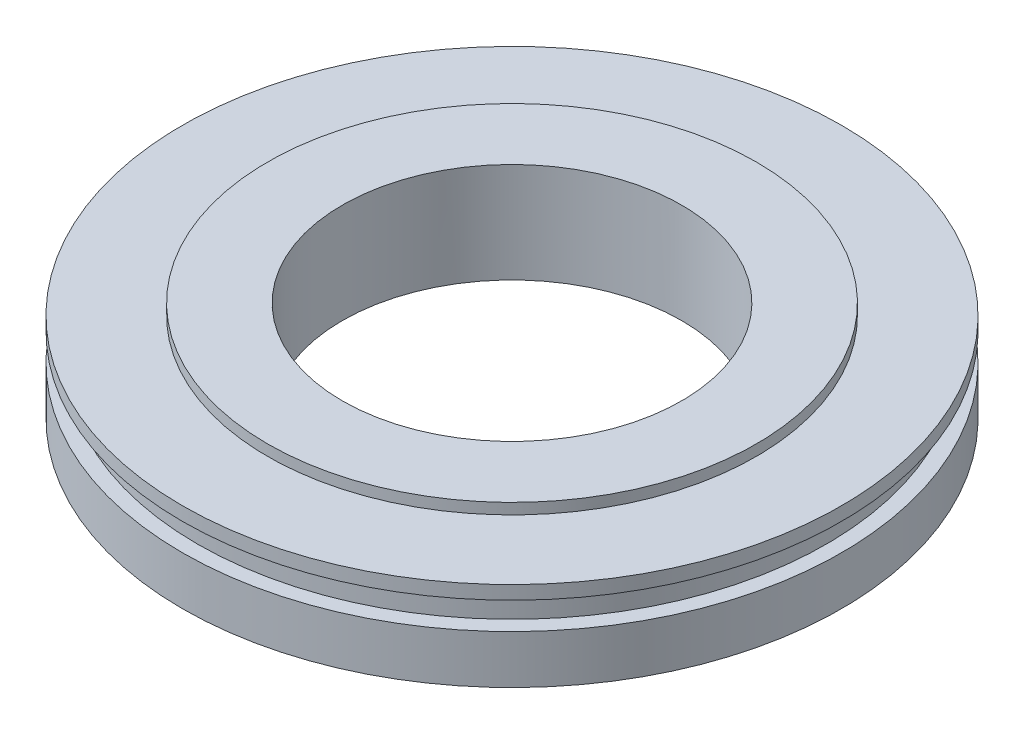
ISO-10303-21;
HEADER;
FILE_DESCRIPTION(('STEP AP214'),'2;1');
FILE_NAME('part.step','',(''),(''),'','','');
FILE_SCHEMA(('AUTOMOTIVE_DESIGN { 1 0 10303 214 1 1 1 1 }'));
ENDSEC;
DATA;
#1=APPLICATION_CONTEXT('core data for automotive mechanical design processes');
#2=APPLICATION_PROTOCOL_DEFINITION('international standard','automotive_design',2000,#1);
#3=PRODUCT_CONTEXT('',#1,'mechanical');
#4=PRODUCT('Part','Part','',(#3));
#5=PRODUCT_RELATED_PRODUCT_CATEGORY('part','',(#4));
#6=PRODUCT_DEFINITION_FORMATION('','',#4);
#7=PRODUCT_DEFINITION_CONTEXT('part definition',#1,'design');
#8=PRODUCT_DEFINITION('design','',#6,#7);
#9=PRODUCT_DEFINITION_SHAPE('','',#8);
#10=(LENGTH_UNIT() NAMED_UNIT(*) SI_UNIT(.MILLI.,.METRE.));
#11=(NAMED_UNIT(*) PLANE_ANGLE_UNIT() SI_UNIT($,.RADIAN.));
#12=(NAMED_UNIT(*) SI_UNIT($,.STERADIAN.) SOLID_ANGLE_UNIT());
#13=UNCERTAINTY_MEASURE_WITH_UNIT(LENGTH_MEASURE(1.E-05),#10,'distance_accuracy_value','');
#14=(GEOMETRIC_REPRESENTATION_CONTEXT(3) GLOBAL_UNCERTAINTY_ASSIGNED_CONTEXT((#13)) GLOBAL_UNIT_ASSIGNED_CONTEXT((#10,
#11,#12)) REPRESENTATION_CONTEXT('',''));
#15=CARTESIAN_POINT('',(0.,0.,0.));
#16=DIRECTION('',(0.,0.,1.));
#17=DIRECTION('',(1.,0.,0.));
#18=AXIS2_PLACEMENT_3D('',#15,#16,#17);
#19=CARTESIAN_POINT('',(0.,2.74793199999976,0.));
#20=DIRECTION('',(0.,-1.,0.));
#21=DIRECTION('',(0.,0.,-1.));
#22=AXIS2_PLACEMENT_3D('',#19,#20,#21);
#23=PLANE('',#22);
#24=CARTESIAN_POINT('',(0.,2.74793199999976,0.));
#25=DIRECTION('',(0.,-1.,0.));
#26=DIRECTION('',(0.,0.,-1.));
#27=AXIS2_PLACEMENT_3D('',#24,#25,#26);
#28=CIRCLE('',#27,30.84068);
#29=CARTESIAN_POINT('',(0.,2.74793199999976,-30.84068));
#30=VERTEX_POINT('',#29);
#31=EDGE_CURVE('E71',#30,#30,#28,.T.);
#32=ORIENTED_EDGE('',*,*,#31,.F.);
#33=EDGE_LOOP('',(#32));
#34=FACE_BOUND('',#33,.T.);
#35=CARTESIAN_POINT('',(0.,2.74793199999976,0.));
#36=DIRECTION('',(0.,-1.,0.));
#37=DIRECTION('',(0.,0.,-1.));
#38=AXIS2_PLACEMENT_3D('',#35,#36,#37);
#39=CIRCLE('',#38,22.86);
#40=CARTESIAN_POINT('',(0.,2.74793199999976,-22.86));
#41=VERTEX_POINT('',#40);
#42=EDGE_CURVE('E10',#41,#41,#39,.F.);
#43=ORIENTED_EDGE('',*,*,#42,.F.);
#44=EDGE_LOOP('',(#43));
#45=FACE_BOUND('',#44,.T.);
#46=ADVANCED_FACE('F43',(#34,#45),#23,.F.);
#47=CARTESIAN_POINT('',(0.,0.,0.));
#48=DIRECTION('',(0.,1.,0.));
#49=DIRECTION('',(0.,0.,1.));
#50=AXIS2_PLACEMENT_3D('',#47,#48,#49);
#51=CYLINDRICAL_SURFACE('',#50,15.875);
#52=CARTESIAN_POINT('',(0.,3.76393199999976,0.));
#53=DIRECTION('',(0.,1.,0.));
#54=DIRECTION('',(0.,0.,1.));
#55=AXIS2_PLACEMENT_3D('',#52,#53,#54);
#56=CIRCLE('',#55,15.875);
#57=CARTESIAN_POINT('',(0.,3.76393199999976,15.875));
#58=VERTEX_POINT('',#57);
#59=EDGE_CURVE('E79',#58,#58,#56,.T.);
#60=ORIENTED_EDGE('',*,*,#59,.T.);
#61=EDGE_LOOP('',(#60));
#62=FACE_BOUND('',#61,.T.);
#63=CARTESIAN_POINT('',(0.,-5.59993800000007,0.));
#64=DIRECTION('',(0.,-1.,0.));
#65=DIRECTION('',(0.,0.,-1.));
#66=AXIS2_PLACEMENT_3D('',#63,#64,#65);
#67=CIRCLE('',#66,15.875);
#68=CARTESIAN_POINT('',(0.,-5.59993800000007,-15.875));
#69=VERTEX_POINT('',#68);
#70=EDGE_CURVE('E87',#69,#69,#67,.T.);
#71=ORIENTED_EDGE('',*,*,#70,.T.);
#72=EDGE_LOOP('',(#71));
#73=FACE_BOUND('',#72,.T.);
#74=ADVANCED_FACE('F45',(#62,#73),#51,.F.);
#75=CARTESIAN_POINT('',(0.,0.,0.));
#76=DIRECTION('',(0.,1.,0.));
#77=DIRECTION('',(0.,0.,1.));
#78=AXIS2_PLACEMENT_3D('',#75,#76,#77);
#79=CYLINDRICAL_SURFACE('',#78,30.84068);
#80=CARTESIAN_POINT('',(0.,-1.06206800000024,0.));
#81=DIRECTION('',(0.,1.,0.));
#82=DIRECTION('',(0.,0.,1.));
#83=AXIS2_PLACEMENT_3D('',#80,#81,#82);
#84=CIRCLE('',#83,30.84068);
#85=CARTESIAN_POINT('',(0.,-1.06206800000024,30.84068));
#86=VERTEX_POINT('',#85);
#87=EDGE_CURVE('E51',#86,#86,#84,.T.);
#88=ORIENTED_EDGE('',*,*,#87,.F.);
#89=EDGE_LOOP('',(#88));
#90=FACE_BOUND('',#89,.T.);
#91=CARTESIAN_POINT('',(0.,-5.59993800000007,0.));
#92=DIRECTION('',(0.,-1.,0.));
#93=DIRECTION('',(0.,0.,-1.));
#94=AXIS2_PLACEMENT_3D('',#91,#92,#93);
#95=CIRCLE('',#94,30.84068);
#96=CARTESIAN_POINT('',(0.,-5.59993800000007,-30.84068));
#97=VERTEX_POINT('',#96);
#98=EDGE_CURVE('E83',#97,#97,#95,.T.);
#99=ORIENTED_EDGE('',*,*,#98,.F.);
#100=EDGE_LOOP('',(#99));
#101=FACE_BOUND('',#100,.T.);
#102=ADVANCED_FACE('F114',(#90,#101),#79,.T.);
#103=CARTESIAN_POINT('',(0.,-1.06206800000024,30.84068));
#104=DIRECTION('',(0.,1.,0.));
#105=DIRECTION('',(0.,0.,1.));
#106=AXIS2_PLACEMENT_3D('',#103,#104,#105);
#107=PLANE('',#106);
#108=ORIENTED_EDGE('',*,*,#87,.T.);
#109=EDGE_LOOP('',(#108));
#110=FACE_BOUND('',#109,.T.);
#111=CARTESIAN_POINT('',(0.,-1.06206800000024,0.));
#112=DIRECTION('',(0.,1.,0.));
#113=DIRECTION('',(0.,0.,1.));
#114=AXIS2_PLACEMENT_3D('',#111,#112,#113);
#115=CIRCLE('',#114,29.43479);
#116=CARTESIAN_POINT('',(0.,-1.06206800000024,29.43479));
#117=VERTEX_POINT('',#116);
#118=EDGE_CURVE('E56',#117,#117,#115,.T.);
#119=ORIENTED_EDGE('',*,*,#118,.F.);
#120=EDGE_LOOP('',(#119));
#121=FACE_BOUND('',#120,.T.);
#122=ADVANCED_FACE('F129',(#110,#121),#107,.T.);
#123=CARTESIAN_POINT('',(0.,0.,0.));
#124=DIRECTION('',(0.,1.,0.));
#125=DIRECTION('',(0.,0.,1.));
#126=AXIS2_PLACEMENT_3D('',#123,#124,#125);
#127=CYLINDRICAL_SURFACE('',#126,29.43479);
#128=ORIENTED_EDGE('',*,*,#118,.T.);
#129=EDGE_LOOP('',(#128));
#130=FACE_BOUND('',#129,.T.);
#131=CARTESIAN_POINT('',(0.,1.47793199999976,0.));
#132=DIRECTION('',(0.,1.,0.));
#133=DIRECTION('',(0.,0.,1.));
#134=AXIS2_PLACEMENT_3D('',#131,#132,#133);
#135=CIRCLE('',#134,29.43479);
#136=CARTESIAN_POINT('',(0.,1.47793199999976,29.43479));
#137=VERTEX_POINT('',#136);
#138=EDGE_CURVE('E61',#137,#137,#135,.T.);
#139=ORIENTED_EDGE('',*,*,#138,.F.);
#140=EDGE_LOOP('',(#139));
#141=FACE_BOUND('',#140,.T.);
#142=ADVANCED_FACE('F125',(#130,#141),#127,.T.);
#143=CARTESIAN_POINT('',(0.,1.47793199999976,29.43479));
#144=DIRECTION('',(0.,-1.,0.));
#145=DIRECTION('',(0.,0.,-1.));
#146=AXIS2_PLACEMENT_3D('',#143,#144,#145);
#147=PLANE('',#146);
#148=ORIENTED_EDGE('',*,*,#138,.T.);
#149=EDGE_LOOP('',(#148));
#150=FACE_BOUND('',#149,.T.);
#151=CARTESIAN_POINT('',(0.,1.47793199999976,0.));
#152=DIRECTION('',(0.,1.,0.));
#153=DIRECTION('',(0.,0.,1.));
#154=AXIS2_PLACEMENT_3D('',#151,#152,#153);
#155=CIRCLE('',#154,30.84068);
#156=CARTESIAN_POINT('',(0.,1.47793199999976,30.84068));
#157=VERTEX_POINT('',#156);
#158=EDGE_CURVE('E67',#157,#157,#155,.T.);
#159=ORIENTED_EDGE('',*,*,#158,.F.);
#160=EDGE_LOOP('',(#159));
#161=FACE_BOUND('',#160,.T.);
#162=ADVANCED_FACE('F121',(#150,#161),#147,.T.);
#163=CARTESIAN_POINT('',(0.,0.,0.));
#164=DIRECTION('',(0.,1.,0.));
#165=DIRECTION('',(0.,0.,1.));
#166=AXIS2_PLACEMENT_3D('',#163,#164,#165);
#167=CYLINDRICAL_SURFACE('',#166,30.84068);
#168=ORIENTED_EDGE('',*,*,#158,.T.);
#169=EDGE_LOOP('',(#168));
#170=FACE_BOUND('',#169,.T.);
#171=ORIENTED_EDGE('',*,*,#31,.T.);
#172=EDGE_LOOP('',(#171));
#173=FACE_BOUND('',#172,.T.);
#174=ADVANCED_FACE('F119',(#170,#173),#167,.T.);
#175=CARTESIAN_POINT('',(0.,3.76393199999976,0.));
#176=DIRECTION('',(0.,1.,0.));
#177=DIRECTION('',(0.,0.,1.));
#178=AXIS2_PLACEMENT_3D('',#175,#176,#177);
#179=PLANE('',#178);
#180=CARTESIAN_POINT('',(0.,3.76393199999976,0.));
#181=DIRECTION('',(0.,1.,0.));
#182=DIRECTION('',(0.,0.,1.));
#183=AXIS2_PLACEMENT_3D('',#180,#181,#182);
#184=CIRCLE('',#183,22.86);
#185=CARTESIAN_POINT('',(0.,3.76393199999976,22.86));
#186=VERTEX_POINT('',#185);
#187=EDGE_CURVE('E75',#186,#186,#184,.T.);
#188=ORIENTED_EDGE('',*,*,#187,.T.);
#189=EDGE_LOOP('',(#188));
#190=FACE_BOUND('',#189,.T.);
#191=ORIENTED_EDGE('',*,*,#59,.F.);
#192=EDGE_LOOP('',(#191));
#193=FACE_BOUND('',#192,.T.);
#194=ADVANCED_FACE('F102',(#190,#193),#179,.T.);
#195=CARTESIAN_POINT('',(0.,3.76393199999976,0.));
#196=DIRECTION('',(0.,-1.,0.));
#197=DIRECTION('',(0.,0.,-1.));
#198=AXIS2_PLACEMENT_3D('',#195,#196,#197);
#199=CYLINDRICAL_SURFACE('',#198,22.86);
#200=ORIENTED_EDGE('',*,*,#187,.F.);
#201=EDGE_LOOP('',(#200));
#202=FACE_BOUND('',#201,.T.);
#203=ORIENTED_EDGE('',*,*,#42,.T.);
#204=EDGE_LOOP('',(#203));
#205=FACE_BOUND('',#204,.T.);
#206=ADVANCED_FACE('F95',(#202,#205),#199,.T.);
#207=CARTESIAN_POINT('',(0.,-5.59993800000007,0.));
#208=DIRECTION('',(0.,-1.,0.));
#209=DIRECTION('',(0.,0.,-1.));
#210=AXIS2_PLACEMENT_3D('',#207,#208,#209);
#211=PLANE('',#210);
#212=ORIENTED_EDGE('',*,*,#98,.T.);
#213=EDGE_LOOP('',(#212));
#214=FACE_BOUND('',#213,.T.);
#215=ORIENTED_EDGE('',*,*,#70,.F.);
#216=EDGE_LOOP('',(#215));
#217=FACE_BOUND('',#216,.T.);
#218=ADVANCED_FACE('F93',(#214,#217),#211,.T.);
#219=CLOSED_SHELL('',(#46,#74,#102,#122,#142,#162,#174,#194,#206,#218));
#220=MANIFOLD_SOLID_BREP('B2',#219);
#221=ADVANCED_BREP_SHAPE_REPRESENTATION('',(#18,#220),#14);
#222=SHAPE_DEFINITION_REPRESENTATION(#9,#221);
ENDSEC;
END-ISO-10303-21;
